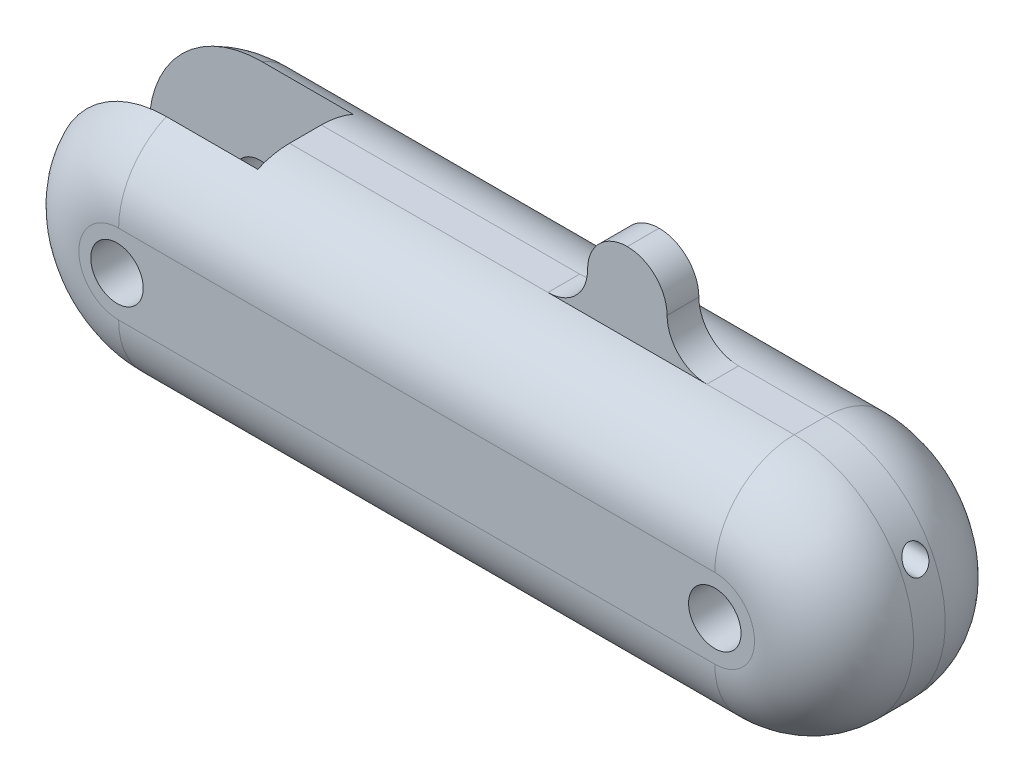
ISO-10303-21;
HEADER;
FILE_DESCRIPTION(('STEP AP214'),'2;1');
FILE_NAME('part.step','',(''),(''),'','','');
FILE_SCHEMA(('AUTOMOTIVE_DESIGN { 1 0 10303 214 1 1 1 1 }'));
ENDSEC;
DATA;
#1=APPLICATION_CONTEXT('core data for automotive mechanical design processes');
#2=APPLICATION_PROTOCOL_DEFINITION('international standard','automotive_design',2000,#1);
#3=PRODUCT_CONTEXT('',#1,'mechanical');
#4=PRODUCT('Part','Part','',(#3));
#5=PRODUCT_RELATED_PRODUCT_CATEGORY('part','',(#4));
#6=PRODUCT_DEFINITION_FORMATION('','',#4);
#7=PRODUCT_DEFINITION_CONTEXT('part definition',#1,'design');
#8=PRODUCT_DEFINITION('design','',#6,#7);
#9=PRODUCT_DEFINITION_SHAPE('','',#8);
#10=(LENGTH_UNIT() NAMED_UNIT(*) SI_UNIT(.MILLI.,.METRE.));
#11=(NAMED_UNIT(*) PLANE_ANGLE_UNIT() SI_UNIT($,.RADIAN.));
#12=(NAMED_UNIT(*) SI_UNIT($,.STERADIAN.) SOLID_ANGLE_UNIT());
#13=UNCERTAINTY_MEASURE_WITH_UNIT(LENGTH_MEASURE(1.E-05),#10,'distance_accuracy_value','');
#14=(GEOMETRIC_REPRESENTATION_CONTEXT(3) GLOBAL_UNCERTAINTY_ASSIGNED_CONTEXT((#13)) GLOBAL_UNIT_ASSIGNED_CONTEXT((#10,
#11,#12)) REPRESENTATION_CONTEXT('',''));
#15=CARTESIAN_POINT('',(0.,0.,0.));
#16=DIRECTION('',(0.,0.,1.));
#17=DIRECTION('',(1.,0.,0.));
#18=AXIS2_PLACEMENT_3D('',#15,#16,#17);
#19=CARTESIAN_POINT('',(-18.75,0.,12.));
#20=DIRECTION('',(0.,-1.,0.));
#21=DIRECTION('',(0.,0.,-1.));
#22=AXIS2_PLACEMENT_3D('',#19,#20,#21);
#23=PLANE('',#22);
#24=DIRECTION('',(-1.,0.,0.));
#25=VECTOR('',#24,1.);
#26=CARTESIAN_POINT('',(-18.75,0.,7.));
#27=LINE('',#26,#25);
#28=CARTESIAN_POINT('',(-13.,0.,7.));
#29=VERTEX_POINT('',#28);
#30=CARTESIAN_POINT('',(3.25,0.,7.));
#31=VERTEX_POINT('',#30);
#32=EDGE_CURVE('E400',#29,#31,#27,.F.);
#33=ORIENTED_EDGE('',*,*,#32,.T.);
#34=DIRECTION('',(0.,0.,1.));
#35=VECTOR('',#34,1.);
#36=CARTESIAN_POINT('',(3.25,0.,5.));
#37=LINE('',#36,#35);
#38=CARTESIAN_POINT('',(3.25,0.,5.));
#39=VERTEX_POINT('',#38);
#40=EDGE_CURVE('E302',#31,#39,#37,.F.);
#41=ORIENTED_EDGE('',*,*,#40,.T.);
#42=DIRECTION('',(-1.,0.,0.));
#43=VECTOR('',#42,1.);
#44=CARTESIAN_POINT('',(-18.75,0.,5.));
#45=LINE('',#44,#43);
#46=CARTESIAN_POINT('',(-13.,0.,5.));
#47=VERTEX_POINT('',#46);
#48=EDGE_CURVE('E402',#39,#47,#45,.T.);
#49=ORIENTED_EDGE('',*,*,#48,.T.);
#50=DIRECTION('',(0.,0.,1.));
#51=VECTOR('',#50,1.);
#52=CARTESIAN_POINT('',(-13.,0.,3.));
#53=LINE('',#52,#51);
#54=EDGE_CURVE('E334',#47,#29,#53,.T.);
#55=ORIENTED_EDGE('',*,*,#54,.T.);
#56=EDGE_LOOP('',(#33,#41,#49,#55));
#57=FACE_BOUND('',#56,.T.);
#58=ADVANCED_FACE('F32',(#57),#23,.F.);
#59=CARTESIAN_POINT('',(18.75,0.,5.));
#60=VERTEX_POINT('',#59);
#61=CARTESIAN_POINT('',(13.25,0.,5.));
#62=VERTEX_POINT('',#61);
#63=EDGE_CURVE('E403',#60,#62,#45,.T.);
#64=ORIENTED_EDGE('',*,*,#63,.T.);
#65=DIRECTION('',(0.,0.,-1.));
#66=VECTOR('',#65,1.);
#67=CARTESIAN_POINT('',(13.25,0.,7.));
#68=LINE('',#67,#66);
#69=CARTESIAN_POINT('',(13.25,0.,7.));
#70=VERTEX_POINT('',#69);
#71=EDGE_CURVE('E309',#62,#70,#68,.F.);
#72=ORIENTED_EDGE('',*,*,#71,.T.);
#73=CARTESIAN_POINT('',(18.75,0.,7.));
#74=VERTEX_POINT('',#73);
#75=EDGE_CURVE('E399',#70,#74,#27,.F.);
#76=ORIENTED_EDGE('',*,*,#75,.T.);
#77=DIRECTION('',(0.,0.,-1.));
#78=VECTOR('',#77,1.);
#79=CARTESIAN_POINT('',(18.75,0.,12.));
#80=LINE('',#79,#78);
#81=EDGE_CURVE('E364',#74,#60,#80,.T.);
#82=ORIENTED_EDGE('',*,*,#81,.T.);
#83=EDGE_LOOP('',(#64,#72,#76,#82));
#84=FACE_BOUND('',#83,.T.);
#85=ADVANCED_FACE('F251',(#84),#23,.F.);
#86=CARTESIAN_POINT('',(18.75,-7.5,12.));
#87=DIRECTION('',(0.,0.,-1.));
#88=DIRECTION('',(-1.,0.,0.));
#89=AXIS2_PLACEMENT_3D('',#86,#87,#88);
#90=CYLINDRICAL_SURFACE('',#89,7.5);
#91=CARTESIAN_POINT('',(25.3832495807108,-4.,5.25));
#92=CARTESIAN_POINT('',(25.4068652100945,-4.04475712896393,5.25000069696609));
#93=CARTESIAN_POINT('',(25.4300293767484,-4.08976492895581,5.25400927517588));
#94=CARTESIAN_POINT('',(25.4748658777341,-4.1790551435472,5.27027538348579));
#95=CARTESIAN_POINT('',(25.4965380552073,-4.22333748150426,5.28253377946583));
#96=CARTESIAN_POINT('',(25.5379116758938,-4.30992682615475,5.31545723063562));
#97=CARTESIAN_POINT('',(25.5576045419242,-4.35222484491178,5.336157060362));
#98=CARTESIAN_POINT('',(25.5943674457023,-4.43298144567067,5.38577757165474));
#99=CARTESIAN_POINT('',(25.6114387598698,-4.47144189295035,5.41469423281491));
#100=CARTESIAN_POINT('',(25.6411623275913,-4.53973742839442,5.47736494318931));
#101=CARTESIAN_POINT('',(25.6540660292328,-4.57002664644258,5.51050419857445));
#102=CARTESIAN_POINT('',(25.6769531189977,-4.62455266895225,5.58231320481981));
#103=CARTESIAN_POINT('',(25.6869382953721,-4.64879317826637,5.62097954737949));
#104=CARTESIAN_POINT('',(25.7029869063967,-4.68817040363519,5.69891372918083));
#105=CARTESIAN_POINT('',(25.7093235719089,-4.70393268754241,5.73781010676271));
#106=CARTESIAN_POINT('',(25.7192604124838,-4.72879255774519,5.81800707831997));
#107=CARTESIAN_POINT('',(25.7228616243726,-4.73789266917448,5.85930675496975));
#108=CARTESIAN_POINT('',(25.7271383733366,-4.74871452689673,5.94068250069715));
#109=CARTESIAN_POINT('',(25.727964010453,-4.75081476114192,5.98070082955287));
#110=CARTESIAN_POINT('',(25.7270983322195,-4.7486184483497,6.0605308390464));
#111=CARTESIAN_POINT('',(25.7254073999443,-4.74432287488856,6.10034255021011));
#112=CARTESIAN_POINT('',(25.7195866751644,-4.72963511410702,6.17795271899597));
#113=CARTESIAN_POINT('',(25.7154973975341,-4.71934422356824,6.21577350399643));
#114=CARTESIAN_POINT('',(25.7049825205337,-4.69314838459035,6.28906769075069));
#115=CARTESIAN_POINT('',(25.6985568521372,-4.67724327028505,6.32454102311476));
#116=CARTESIAN_POINT('',(25.6833388667533,-4.6400662297977,6.3928822815331));
#117=CARTESIAN_POINT('',(25.6745047094671,-4.61869988546116,6.42568939411337));
#118=CARTESIAN_POINT('',(25.6546866646446,-4.57152680231289,6.48719637753227));
#119=CARTESIAN_POINT('',(25.6437023940896,-4.54571927245274,6.51589551500178));
#120=CARTESIAN_POINT('',(25.6191641560276,-4.48908949081756,6.57000258230613));
#121=CARTESIAN_POINT('',(25.6055068553954,-4.45807722125552,6.59516434647811));
#122=CARTESIAN_POINT('',(25.5763026183871,-4.39309447378723,6.63994971569264));
#123=CARTESIAN_POINT('',(25.5607550987679,-4.35912308374077,6.65957160512374));
#124=CARTESIAN_POINT('',(25.5267476900571,-4.28636850281493,6.69444106370555));
#125=CARTESIAN_POINT('',(25.5081540750848,-4.24741815677612,6.709208755228));
#126=CARTESIAN_POINT('',(25.46950375169,-4.1683021174959,6.73203260387972));
#127=CARTESIAN_POINT('',(25.4494464555126,-4.12813593985681,6.74008604853172));
#128=CARTESIAN_POINT('',(25.4063085373536,-4.04369983150147,6.75004397376913));
#129=CARTESIAN_POINT('',(25.3831223675881,-3.99940542782164,6.75128539519353));
#130=CARTESIAN_POINT('',(25.3360588230827,-3.9116419942855,6.74607476207136));
#131=CARTESIAN_POINT('',(25.3121811684306,-3.86817331081141,6.73961954823107));
#132=CARTESIAN_POINT('',(25.2624790173255,-3.77973344935154,6.71847576043198));
#133=CARTESIAN_POINT('',(25.236647679833,-3.73490877068936,6.7031853128459));
#134=CARTESIAN_POINT('',(25.1857343535149,-3.64852752977385,6.66423898345622));
#135=CARTESIAN_POINT('',(25.1606529100033,-3.60697331155974,6.6405771671965));
#136=CARTESIAN_POINT('',(25.1121650327383,-3.52822396654694,6.58503138384833));
#137=CARTESIAN_POINT('',(25.0887675581801,-3.49105156771563,6.55310707545873));
#138=CARTESIAN_POINT('',(25.0451208610375,-3.42285769464485,6.48149765334737));
#139=CARTESIAN_POINT('',(25.0248655342586,-3.39182426121487,6.44182793409187));
#140=CARTESIAN_POINT('',(24.9941296604099,-3.34531674164022,6.36773463912215));
#141=CARTESIAN_POINT('',(24.9825031742713,-3.32792254459538,6.33498389337064));
#142=CARTESIAN_POINT('',(24.9623269530317,-3.29793850852277,6.266466154486));
#143=CARTESIAN_POINT('',(24.9537747168345,-3.28534476351841,6.23070164261996));
#144=CARTESIAN_POINT('',(24.9402984185428,-3.26557533684953,6.15681284743056));
#145=CARTESIAN_POINT('',(24.9353946024228,-3.2584298837293,6.11867665017428));
#146=CARTESIAN_POINT('',(24.9297033076017,-3.25014186597953,6.04145384644772));
#147=CARTESIAN_POINT('',(24.9289142561407,-3.2489970077805,6.00236760884515));
#148=CARTESIAN_POINT('',(24.9313931710046,-3.25260309406563,5.92827495646399));
#149=CARTESIAN_POINT('',(24.9342899276402,-3.25681456761362,5.8932277732572));
#150=CARTESIAN_POINT('',(24.943308211172,-3.26998861428829,5.82447604328706));
#151=CARTESIAN_POINT('',(24.9494299026123,-3.27895142984032,5.79077156512622));
#152=CARTESIAN_POINT('',(24.9646133796125,-3.30133780469566,5.72505739919943));
#153=CARTESIAN_POINT('',(24.9737143408386,-3.31482086291967,5.69307729890249));
#154=CARTESIAN_POINT('',(24.9943359325697,-3.3456514298456,5.63189268510943));
#155=CARTESIAN_POINT('',(25.005857406406,-3.36300028555895,5.60268914415963));
#156=CARTESIAN_POINT('',(25.0323887723703,-3.40338626249218,5.54395537476474));
#157=CARTESIAN_POINT('',(25.0476550846796,-3.42686421313565,5.51484516788648));
#158=CARTESIAN_POINT('',(25.0799678350555,-3.47726403649822,5.46091603715502));
#159=CARTESIAN_POINT('',(25.0970153888876,-3.50418807023977,5.43609982921319));
#160=CARTESIAN_POINT('',(25.1352466837685,-3.56551988782083,5.38721317350811));
#161=CARTESIAN_POINT('',(25.1566486852218,-3.60042939812047,5.3639419420298));
#162=CARTESIAN_POINT('',(25.2003628456514,-3.67317076129835,5.32367729284259));
#163=CARTESIAN_POINT('',(25.2226753450833,-3.71100371213012,5.30668624776824));
#164=CARTESIAN_POINT('',(25.2682375061319,-3.78991735324902,5.2787743942519));
#165=CARTESIAN_POINT('',(25.2914956207364,-3.83106029081337,5.26804311416664));
#166=CARTESIAN_POINT('',(25.3377229967265,-3.91472586515507,5.25365538695503));
#167=CARTESIAN_POINT('',(25.3606922419369,-3.95724857871951,5.24999933426715));
#168=CARTESIAN_POINT('',(25.3832495807108,-4.,5.25));
#169=B_SPLINE_CURVE_WITH_KNOTS('',3,(#91,#92,#93,#94,#95,#96,#97,#98,#99,#100,#101,#102,#103,
#104,#105,#106,#107,#108,#109,#110,#111,#112,#113,#114,#115,#116,#117,#118,#119,#120,#121,#122,
#123,#124,#125,#126,#127,#128,#129,#130,#131,#132,#133,#134,#135,#136,#137,#138,#139,#140,#141,
#142,#143,#144,#145,#146,#147,#148,#149,#150,#151,#152,#153,#154,#155,#156,#157,#158,#159,#160,
#161,#162,#163,#164,#165,#166,#167,#168),.UNSPECIFIED.,.T.,.F.,(4,2,2,2,2,2,2,2,2,2,2,2,2,2,2,2,
2,2,2,2,2,2,2,2,2,2,2,2,2,2,2,2,2,2,2,2,2,2,4),(0.,0.151661005421156,0.303337931279043,
0.455646106620899,0.607879887173716,0.747256765609741,0.886548064567126,1.0132272857131,
1.13985846730141,1.25952084912075,1.37916501767402,1.49684401087809,1.61452648107236,
1.73440026024667,1.85429541305984,1.98037574012026,2.10649506953991,2.24277688192368,
2.37911372392493,2.5285129963975,2.67797361499162,2.83907034561564,3.00028150715968,
3.16229513316742,3.32398996653119,3.44011001590396,3.55613537933345,3.67279988942347,
3.78941980432112,3.89517224873058,4.00093008941375,4.10813854282546,4.21538441088787,
4.33610582335719,4.45690331400403,4.59763975196048,4.73842930548272,4.88328582896064,
5.02815042784518),.UNSPECIFIED.);
#170=CARTESIAN_POINT('',(25.3832495807108,-4.,5.25));
#171=VERTEX_POINT('',#170);
#172=EDGE_CURVE('E180',#171,#171,#169,.T.);
#173=ORIENTED_EDGE('',*,*,#172,.T.);
#174=EDGE_LOOP('',(#173));
#175=FACE_BOUND('',#174,.T.);
#176=DIRECTION('',(0.,0.,-1.));
#177=VECTOR('',#176,1.);
#178=CARTESIAN_POINT('',(18.75,-15.,12.));
#179=LINE('',#178,#177);
#180=CARTESIAN_POINT('',(18.75,-15.,7.));
#181=VERTEX_POINT('',#180);
#182=CARTESIAN_POINT('',(18.75,-15.,5.));
#183=VERTEX_POINT('',#182);
#184=EDGE_CURVE('E361',#181,#183,#179,.T.);
#185=ORIENTED_EDGE('',*,*,#184,.T.);
#186=CARTESIAN_POINT('',(18.75,-7.5,5.));
#187=DIRECTION('',(0.,0.,-1.));
#188=DIRECTION('',(-1.,0.,0.));
#189=AXIS2_PLACEMENT_3D('',#186,#187,#188);
#190=CIRCLE('',#189,7.5);
#191=EDGE_CURVE('E371',#183,#60,#190,.F.);
#192=ORIENTED_EDGE('',*,*,#191,.T.);
#193=ORIENTED_EDGE('',*,*,#81,.F.);
#194=CARTESIAN_POINT('',(18.75,-7.5,7.));
#195=DIRECTION('',(0.,0.,-1.));
#196=DIRECTION('',(-1.,0.,0.));
#197=AXIS2_PLACEMENT_3D('',#194,#195,#196);
#198=CIRCLE('',#197,7.5);
#199=EDGE_CURVE('E368',#74,#181,#198,.T.);
#200=ORIENTED_EDGE('',*,*,#199,.T.);
#201=EDGE_LOOP('',(#185,#192,#193,#200));
#202=FACE_BOUND('',#201,.T.);
#203=ADVANCED_FACE('F256',(#175,#202),#90,.T.);
#204=CARTESIAN_POINT('',(-18.75,-15.,12.));
#205=DIRECTION('',(0.,1.,0.));
#206=DIRECTION('',(0.,0.,1.));
#207=AXIS2_PLACEMENT_3D('',#204,#205,#206);
#208=PLANE('',#207);
#209=DIRECTION('',(0.,0.,1.));
#210=VECTOR('',#209,1.);
#211=CARTESIAN_POINT('',(12.75,-15.,12.));
#212=LINE('',#211,#210);
#213=CARTESIAN_POINT('',(12.75,-15.,5.25));
#214=VERTEX_POINT('',#213);
#215=CARTESIAN_POINT('',(12.75,-15.,6.75));
#216=VERTEX_POINT('',#215);
#217=EDGE_CURVE('E11',#214,#216,#212,.T.);
#218=ORIENTED_EDGE('',*,*,#217,.F.);
#219=CARTESIAN_POINT('',(12.75,-15.,5.25));
#220=CARTESIAN_POINT('',(12.6279031105187,-14.9999999999993,5.25000254582657));
#221=CARTESIAN_POINT('',(12.5058081520973,-14.9999999999997,5.25071867078466));
#222=CARTESIAN_POINT('',(12.2616319605479,-15.0000000000003,5.25360404575604));
#223=CARTESIAN_POINT('',(12.1395507279131,-15.0000000000007,5.25577333739408));
#224=CARTESIAN_POINT('',(11.7733405529742,-14.9999999999987,5.26450014872843));
#225=CARTESIAN_POINT('',(11.5292574943999,-14.9999999999933,5.27327660984739));
#226=CARTESIAN_POINT('',(11.1634166185596,-14.9999999999986,5.29137442259027));
#227=CARTESIAN_POINT('',(11.0415324736972,-15.0000000000026,5.29822802504211));
#228=CARTESIAN_POINT('',(10.7978820366982,-14.9999999999974,5.31373211707596));
#229=CARTESIAN_POINT('',(10.6761157396577,-14.9999999999882,5.32238252834828));
#230=CARTESIAN_POINT('',(10.4327271316951,-14.9999999999879,5.34168698501698));
#231=CARTESIAN_POINT('',(10.3111048387448,-14.9999999999968,5.35234125842443));
#232=CARTESIAN_POINT('',(10.0680838593875,-15.0000000000033,5.37595354459899));
#233=CARTESIAN_POINT('',(9.94668516822044,-15.0000000000009,5.38891150773847));
#234=CARTESIAN_POINT('',(9.70416943419978,-14.9999999999991,5.41759079486999));
#235=CARTESIAN_POINT('',(9.58305250341022,-14.9999999999998,5.43331307403886));
#236=CARTESIAN_POINT('',(9.34132147564355,-15.0000000000002,5.4682213234766));
#237=CARTESIAN_POINT('',(9.22070730910105,-15.,5.48740679710216));
#238=CARTESIAN_POINT('',(9.04042541137695,-15.,5.51974697076756));
#239=CARTESIAN_POINT('',(8.98043847484635,-15.,5.53112058542195));
#240=CARTESIAN_POINT('',(8.86076281607908,-15.,5.55532858674183));
#241=CARTESIAN_POINT('',(8.80107406711756,-15.,5.5681628399546));
#242=CARTESIAN_POINT('',(8.68207329683169,-15.,5.59569278146662));
#243=CARTESIAN_POINT('',(8.6227615995042,-15.,5.61038988967094));
#244=CARTESIAN_POINT('',(8.50480756744824,-15.,5.64227280695698));
#245=CARTESIAN_POINT('',(8.44616515917928,-15.0000000000002,5.65945833971805));
#246=CARTESIAN_POINT('',(8.33798530591541,-14.9999999999999,5.69485454825117));
#247=CARTESIAN_POINT('',(8.28830180896599,-14.9999999999995,5.71260167382619));
#248=CARTESIAN_POINT('',(8.21498970784326,-15.0000000000003,5.74244029179922));
#249=CARTESIAN_POINT('',(8.19072098307633,-15.0000000000007,5.75294000274481));
#250=CARTESIAN_POINT('',(8.14287182875721,-14.9999999999993,5.77537551038227));
#251=CARTESIAN_POINT('',(8.11929093980555,-14.9999999999974,5.78731031996813));
#252=CARTESIAN_POINT('',(8.07298517106077,-14.9999999999971,5.81332910183128));
#253=CARTESIAN_POINT('',(8.05027079541636,-14.9999999999987,5.82743277194824));
#254=CARTESIAN_POINT('',(8.01796405003157,-15.0000000000007,5.85090587661612));
#255=CARTESIAN_POINT('',(8.00751768539581,-15.0000000000013,5.85908882758918));
#256=CARTESIAN_POINT('',(7.98747272431623,-14.9999999999987,5.8764702220878));
#257=CARTESIAN_POINT('',(7.97787445964953,-14.9999999999956,5.88566905989046));
#258=CARTESIAN_POINT('',(7.96197651849764,-14.9999999999965,5.9032226478368));
#259=CARTESIAN_POINT('',(7.95541141170035,-14.9999999999991,5.91133333657225));
#260=CARTESIAN_POINT('',(7.94357475708405,-15.0000000000009,5.92845584522835));
#261=CARTESIAN_POINT('',(7.93829991256084,-15.0000000000002,5.93746528398026));
#262=CARTESIAN_POINT('',(7.93102890539874,-14.9999999999999,5.95338584477557));
#263=CARTESIAN_POINT('',(7.92852338987217,-15.,5.96006134589919));
#264=CARTESIAN_POINT('',(7.92463907779112,-15.,5.97372494061358));
#265=CARTESIAN_POINT('',(7.92325755163829,-15.,5.98071223318449));
#266=CARTESIAN_POINT('',(7.92177187965733,-15.,5.99487053913656));
#267=CARTESIAN_POINT('',(7.92167585014173,-15.,6.0020424336657));
#268=CARTESIAN_POINT('',(7.92279483226025,-15.,6.01628349356545));
#269=CARTESIAN_POINT('',(7.92401067645951,-14.9999999999999,6.02335259080985));
#270=CARTESIAN_POINT('',(7.92790254589006,-14.9999999999999,6.03832350402544));
#271=CARTESIAN_POINT('',(7.9307864450267,-15.,6.04617019809489));
#272=CARTESIAN_POINT('',(7.93778340081414,-15.,6.06130848636014));
#273=CARTESIAN_POINT('',(7.94190102609121,-15.,6.0685978886684));
#274=CARTESIAN_POINT('',(7.95403672459536,-15.,6.08721238904936));
#275=CARTESIAN_POINT('',(7.96283432361819,-15.,6.09802166566266));
#276=CARTESIAN_POINT('',(7.98184773151495,-15.,6.11828939144204));
#277=CARTESIAN_POINT('',(7.99206733096049,-15.,6.12774408831073));
#278=CARTESIAN_POINT('',(8.01851487670459,-15.,6.14991608934695));
#279=CARTESIAN_POINT('',(8.03526215285465,-15.0000000000001,6.16200571208245));
#280=CARTESIAN_POINT('',(8.06976260503723,-14.9999999999999,6.18456586503625));
#281=CARTESIAN_POINT('',(8.08751538802825,-14.9999999999998,6.19503702200761));
#282=CARTESIAN_POINT('',(8.12375830799411,-15.0000000000002,6.21485783216037));
#283=CARTESIAN_POINT('',(8.14225198370346,-15.0000000000009,6.22420095391308));
#284=CARTESIAN_POINT('',(8.17967471385401,-14.9999999999991,6.24197726025423));
#285=CARTESIAN_POINT('',(8.19860394623334,-14.9999999999966,6.25041006464596));
#286=CARTESIAN_POINT('',(8.25834246410656,-14.9999999999936,6.27569455474348));
#287=CARTESIAN_POINT('',(8.29968517632697,-14.9999999999983,6.29128139751974));
#288=CARTESIAN_POINT('',(8.38312371622844,-15.0000000000017,6.3202980439071));
#289=CARTESIAN_POINT('',(8.42521999971808,-15.0000000000002,6.33372648936706));
#290=CARTESIAN_POINT('',(8.50975620317274,-14.9999999999998,6.35894851885767));
#291=CARTESIAN_POINT('',(8.55219467577112,-15.0000000000009,6.37074698412765));
#292=CARTESIAN_POINT('',(8.63739549369142,-14.9999999999992,6.39311197102598));
#293=CARTESIAN_POINT('',(8.68015787179652,-14.9999999999964,6.40367836613043));
#294=CARTESIAN_POINT('',(8.8084253424861,-14.9999999999934,6.43381026509647));
#295=CARTESIAN_POINT('',(8.89427395501594,-14.9999999999982,6.45191160186388));
#296=CARTESIAN_POINT('',(9.06652220515574,-15.0000000000018,6.48533687297484));
#297=CARTESIAN_POINT('',(9.15292200408572,-15.0000000000005,6.50065995157057));
#298=CARTESIAN_POINT('',(9.32606662089015,-14.9999999999995,6.5291452930602));
#299=CARTESIAN_POINT('',(9.41281140650453,-14.9999999999999,6.54230775334602));
#300=CARTESIAN_POINT('',(9.58655116393535,-15.0000000000001,6.56687586340296));
#301=CARTESIAN_POINT('',(9.67354614947086,-15.,6.5782814148926));
#302=CARTESIAN_POINT('',(9.93480730803937,-14.9999999999999,6.6102886368843));
#303=CARTESIAN_POINT('',(10.1093447506604,-15.,6.62868010052604));
#304=CARTESIAN_POINT('',(10.4773004566364,-15.,6.66262753595207));
#305=CARTESIAN_POINT('',(10.6707639203776,-15.,6.67767813701678));
#306=CARTESIAN_POINT('',(11.0579726998644,-15.,6.70319345371234));
#307=CARTESIAN_POINT('',(11.2517179929587,-15.,6.71365851944845));
#308=CARTESIAN_POINT('',(11.6627681470924,-15.,6.73157677656177));
#309=CARTESIAN_POINT('',(11.880095448928,-15.,6.73851430325681));
#310=CARTESIAN_POINT('',(12.206207476606,-15.,6.74542192216146));
#311=CARTESIAN_POINT('',(12.3149586134388,-15.,6.74714134210136));
#312=CARTESIAN_POINT('',(12.5324728588604,-15.,6.74942945468232));
#313=CARTESIAN_POINT('',(12.6412359674309,-15.,6.74999814905208));
#314=CARTESIAN_POINT('',(12.75,-15.,6.75));
#315=B_SPLINE_CURVE_WITH_KNOTS('',3,(#219,#220,#221,#222,#223,#224,#225,#226,#227,#228,#229,
#230,#231,#232,#233,#234,#235,#236,#237,#238,#239,#240,#241,#242,#243,#244,#245,#246,#247,#248,
#249,#250,#251,#252,#253,#254,#255,#256,#257,#258,#259,#260,#261,#262,#263,#264,#265,#266,#267,
#268,#269,#270,#271,#272,#273,#274,#275,#276,#277,#278,#279,#280,#281,#282,#283,#284,#285,#286,
#287,#288,#289,#290,#291,#292,#293,#294,#295,#296,#297,#298,#299,#300,#301,#302,#303,#304,#305,
#306,#307,#308,#309,#310,#311,#312,#313,#314),.UNSPECIFIED.,.F.,.F.,(4,2,2,2,2,2,2,2,2,2,2,2,2,
2,2,2,2,2,2,2,2,2,2,2,2,2,2,2,2,2,2,2,2,2,2,2,2,2,2,2,2,2,2,2,2,2,2,4),(0.,0.366284571835835,
0.732579636039433,1.46520683800824,1.83142702707227,2.19763125864202,2.56387718429462,
2.930115220988,3.29648005651964,3.66279239476767,3.84594567424035,4.02908223314375,
4.21235923140004,4.3956158937227,4.55374880961848,4.63304046269176,4.71227788513852,
4.79228283253039,4.83204995805504,4.87183257225204,4.90305778328536,4.93420235836351,
4.95551354701654,4.97677282584144,4.99816626772046,5.01957329468434,5.04451339878243,
5.06954702497481,5.11112127609883,5.15280855242251,5.21461546426789,5.27639838100998,
5.3385234213964,5.40067430891038,5.53311600243491,5.6656407101249,5.7977595250195,
5.92989189554795,6.19302526096668,6.45623953847942,6.71942975560115,6.98263469024013,
7.50905952918245,8.09114162758407,8.67317927631539,9.32543431410319,9.65172349145941,
9.97801217864142),.UNSPECIFIED.);
#316=EDGE_CURVE('E172',#214,#216,#315,.T.);
#317=ORIENTED_EDGE('',*,*,#316,.T.);
#318=EDGE_LOOP('',(#218,#317));
#319=FACE_BOUND('',#318,.T.);
#320=DIRECTION('',(1.,0.,0.));
#321=VECTOR('',#320,1.);
#322=CARTESIAN_POINT('',(-18.75,-15.,7.));
#323=LINE('',#322,#321);
#324=CARTESIAN_POINT('',(-13.,-15.,7.));
#325=VERTEX_POINT('',#324);
#326=EDGE_CURVE('E384',#181,#325,#323,.F.);
#327=ORIENTED_EDGE('',*,*,#326,.T.);
#328=DIRECTION('',(0.,0.,-1.));
#329=VECTOR('',#328,1.);
#330=CARTESIAN_POINT('',(-13.,-15.,12.));
#331=LINE('',#330,#329);
#332=CARTESIAN_POINT('',(-13.,-15.,5.));
#333=VERTEX_POINT('',#332);
#334=EDGE_CURVE('E349',#325,#333,#331,.T.);
#335=ORIENTED_EDGE('',*,*,#334,.T.);
#336=DIRECTION('',(1.,0.,0.));
#337=VECTOR('',#336,1.);
#338=CARTESIAN_POINT('',(18.75,-15.,5.));
#339=LINE('',#338,#337);
#340=EDGE_CURVE('E387',#333,#183,#339,.T.);
#341=ORIENTED_EDGE('',*,*,#340,.T.);
#342=ORIENTED_EDGE('',*,*,#184,.F.);
#343=EDGE_LOOP('',(#327,#335,#341,#342));
#344=FACE_BOUND('',#343,.T.);
#345=ADVANCED_FACE('F175',(#319,#344),#208,.F.);
#346=CARTESIAN_POINT('',(18.75,-7.5,12.));
#347=DIRECTION('',(0.,0.,-1.));
#348=DIRECTION('',(-1.,0.,0.));
#349=AXIS2_PLACEMENT_3D('',#346,#347,#348);
#350=PLANE('',#349);
#351=CARTESIAN_POINT('',(18.75,-7.50000000000001,12.));
#352=DIRECTION('',(0.,0.,1.));
#353=DIRECTION('',(1.,0.,0.));
#354=AXIS2_PLACEMENT_3D('',#351,#352,#353);
#355=CIRCLE('',#354,1.65);
#356=CARTESIAN_POINT('',(20.4,-7.50000000000001,12.));
#357=VERTEX_POINT('',#356);
#358=EDGE_CURVE('E330',#357,#357,#355,.T.);
#359=ORIENTED_EDGE('',*,*,#358,.F.);
#360=EDGE_LOOP('',(#359));
#361=FACE_BOUND('',#360,.T.);
#362=CARTESIAN_POINT('',(-18.8534779771691,-7.50000000000001,12.));
#363=DIRECTION('',(0.,0.,1.));
#364=DIRECTION('',(1.,0.,0.));
#365=AXIS2_PLACEMENT_3D('',#362,#363,#364);
#366=CIRCLE('',#365,1.65);
#367=CARTESIAN_POINT('',(-17.2034779771691,-7.50000000000001,12.));
#368=VERTEX_POINT('',#367);
#369=EDGE_CURVE('E323',#368,#368,#366,.T.);
#370=ORIENTED_EDGE('',*,*,#369,.F.);
#371=EDGE_LOOP('',(#370));
#372=FACE_BOUND('',#371,.T.);
#373=DIRECTION('',(1.,0.,0.));
#374=VECTOR('',#373,1.);
#375=CARTESIAN_POINT('',(18.75,-10.,12.));
#376=LINE('',#375,#374);
#377=CARTESIAN_POINT('',(-18.75,-10.,12.));
#378=VERTEX_POINT('',#377);
#379=CARTESIAN_POINT('',(18.75,-10.,12.));
#380=VERTEX_POINT('',#379);
#381=EDGE_CURVE('E394',#378,#380,#376,.T.);
#382=ORIENTED_EDGE('',*,*,#381,.T.);
#383=CARTESIAN_POINT('',(18.75,-7.5,12.));
#384=DIRECTION('',(0.,0.,-1.));
#385=DIRECTION('',(-1.,0.,0.));
#386=AXIS2_PLACEMENT_3D('',#383,#384,#385);
#387=CIRCLE('',#386,2.5);
#388=CARTESIAN_POINT('',(18.75,-5.,12.));
#389=VERTEX_POINT('',#388);
#390=EDGE_CURVE('E396',#380,#389,#387,.F.);
#391=ORIENTED_EDGE('',*,*,#390,.T.);
#392=DIRECTION('',(-1.,0.,0.));
#393=VECTOR('',#392,1.);
#394=CARTESIAN_POINT('',(18.75,-5.,12.));
#395=LINE('',#394,#393);
#396=CARTESIAN_POINT('',(-18.75,-5.,12.));
#397=VERTEX_POINT('',#396);
#398=EDGE_CURVE('E389',#389,#397,#395,.T.);
#399=ORIENTED_EDGE('',*,*,#398,.T.);
#400=CARTESIAN_POINT('',(-18.75,-7.5,12.));
#401=DIRECTION('',(0.,0.,-1.));
#402=DIRECTION('',(-1.,0.,0.));
#403=AXIS2_PLACEMENT_3D('',#400,#401,#402);
#404=CIRCLE('',#403,2.5);
#405=EDGE_CURVE('E392',#397,#378,#404,.F.);
#406=ORIENTED_EDGE('',*,*,#405,.T.);
#407=EDGE_LOOP('',(#382,#391,#399,#406));
#408=FACE_BOUND('',#407,.T.);
#409=ADVANCED_FACE('F235',(#361,#372,#408),#350,.F.);
#410=CARTESIAN_POINT('',(18.75,-7.5,0.));
#411=DIRECTION('',(0.,0.,-1.));
#412=DIRECTION('',(-1.,0.,0.));
#413=AXIS2_PLACEMENT_3D('',#410,#411,#412);
#414=PLANE('',#413);
#415=CARTESIAN_POINT('',(18.75,-7.50000000000001,0.));
#416=DIRECTION('',(0.,0.,1.));
#417=DIRECTION('',(1.,0.,0.));
#418=AXIS2_PLACEMENT_3D('',#415,#416,#417);
#419=CIRCLE('',#418,1.65);
#420=CARTESIAN_POINT('',(20.4,-7.50000000000001,0.));
#421=VERTEX_POINT('',#420);
#422=EDGE_CURVE('E327',#421,#421,#419,.T.);
#423=ORIENTED_EDGE('',*,*,#422,.T.);
#424=EDGE_LOOP('',(#423));
#425=FACE_BOUND('',#424,.T.);
#426=CARTESIAN_POINT('',(-18.8534779771691,-7.50000000000001,0.));
#427=DIRECTION('',(0.,0.,1.));
#428=DIRECTION('',(1.,0.,0.));
#429=AXIS2_PLACEMENT_3D('',#426,#427,#428);
#430=CIRCLE('',#429,1.65);
#431=CARTESIAN_POINT('',(-17.2034779771691,-7.50000000000001,0.));
#432=VERTEX_POINT('',#431);
#433=EDGE_CURVE('E317',#432,#432,#430,.T.);
#434=ORIENTED_EDGE('',*,*,#433,.T.);
#435=EDGE_LOOP('',(#434));
#436=FACE_BOUND('',#435,.T.);
#437=DIRECTION('',(-1.,0.,0.));
#438=VECTOR('',#437,1.);
#439=CARTESIAN_POINT('',(18.75,-5.,0.));
#440=LINE('',#439,#438);
#441=CARTESIAN_POINT('',(-18.75,-5.,0.));
#442=VERTEX_POINT('',#441);
#443=CARTESIAN_POINT('',(18.75,-5.,0.));
#444=VERTEX_POINT('',#443);
#445=EDGE_CURVE('E374',#442,#444,#440,.F.);
#446=ORIENTED_EDGE('',*,*,#445,.T.);
#447=CARTESIAN_POINT('',(18.75,-7.5,0.));
#448=DIRECTION('',(0.,0.,-1.));
#449=DIRECTION('',(-1.,0.,0.));
#450=AXIS2_PLACEMENT_3D('',#447,#448,#449);
#451=CIRCLE('',#450,2.5);
#452=CARTESIAN_POINT('',(18.75,-10.,0.));
#453=VERTEX_POINT('',#452);
#454=EDGE_CURVE('E381',#444,#453,#451,.T.);
#455=ORIENTED_EDGE('',*,*,#454,.T.);
#456=DIRECTION('',(1.,0.,0.));
#457=VECTOR('',#456,1.);
#458=CARTESIAN_POINT('',(-18.75,-10.,0.));
#459=LINE('',#458,#457);
#460=CARTESIAN_POINT('',(-18.75,-10.,0.));
#461=VERTEX_POINT('',#460);
#462=EDGE_CURVE('E378',#453,#461,#459,.F.);
#463=ORIENTED_EDGE('',*,*,#462,.T.);
#464=CARTESIAN_POINT('',(-18.75,-7.5,0.));
#465=DIRECTION('',(0.,0.,-1.));
#466=DIRECTION('',(-1.,0.,0.));
#467=AXIS2_PLACEMENT_3D('',#464,#465,#466);
#468=CIRCLE('',#467,2.5);
#469=EDGE_CURVE('E376',#461,#442,#468,.T.);
#470=ORIENTED_EDGE('',*,*,#469,.T.);
#471=EDGE_LOOP('',(#446,#455,#463,#470));
#472=FACE_BOUND('',#471,.T.);
#473=ADVANCED_FACE('F237',(#425,#436,#472),#414,.T.);
#474=CARTESIAN_POINT('',(-18.75,-7.5,5.));
#475=DIRECTION('',(0.,0.,-1.));
#476=DIRECTION('',(-1.,0.,0.));
#477=AXIS2_PLACEMENT_3D('',#474,#475,#476);
#478=DEGENERATE_TOROIDAL_SURFACE('',#477,2.5,5.,.T.);
#479=CARTESIAN_POINT('',(-18.75,-7.5,3.));
#480=DIRECTION('',(0.,0.,-1.));
#481=DIRECTION('',(-1.,0.,0.));
#482=AXIS2_PLACEMENT_3D('',#479,#480,#481);
#483=CIRCLE('',#482,7.08257569495584);
#484=CARTESIAN_POINT('',(-18.75,-0.41742430504416,3.));
#485=VERTEX_POINT('',#484);
#486=CARTESIAN_POINT('',(-18.75,-14.5825756949558,3.));
#487=VERTEX_POINT('',#486);
#488=EDGE_CURVE('E356',#485,#487,#483,.F.);
#489=ORIENTED_EDGE('',*,*,#488,.F.);
#490=CARTESIAN_POINT('',(-18.75,-5.,5.));
#491=DIRECTION('',(1.,0.,0.));
#492=DIRECTION('',(0.,1.,0.));
#493=AXIS2_PLACEMENT_3D('',#490,#491,#492);
#494=CIRCLE('',#493,5.);
#495=EDGE_CURVE('E411',#442,#485,#494,.T.);
#496=ORIENTED_EDGE('',*,*,#495,.F.);
#497=ORIENTED_EDGE('',*,*,#469,.F.);
#498=CARTESIAN_POINT('',(-18.75,-10.,5.));
#499=DIRECTION('',(1.,0.,0.));
#500=DIRECTION('',(0.,1.,0.));
#501=AXIS2_PLACEMENT_3D('',#498,#499,#500);
#502=CIRCLE('',#501,5.);
#503=EDGE_CURVE('E365',#487,#461,#502,.T.);
#504=ORIENTED_EDGE('',*,*,#503,.F.);
#505=EDGE_LOOP('',(#489,#496,#497,#504));
#506=FACE_BOUND('',#505,.T.);
#507=ADVANCED_FACE('F240',(#506),#478,.T.);
#508=CARTESIAN_POINT('',(-18.75,-10.,5.));
#509=DIRECTION('',(-1.,0.,0.));
#510=DIRECTION('',(0.,0.,1.));
#511=AXIS2_PLACEMENT_3D('',#508,#509,#510);
#512=CYLINDRICAL_SURFACE('',#511,5.);
#513=CARTESIAN_POINT('',(-13.,-10.,5.));
#514=DIRECTION('',(1.,0.,0.));
#515=DIRECTION('',(0.,0.,-1.));
#516=AXIS2_PLACEMENT_3D('',#513,#514,#515);
#517=CIRCLE('',#516,5.);
#518=CARTESIAN_POINT('',(-13.,-14.5825756949558,3.));
#519=VERTEX_POINT('',#518);
#520=EDGE_CURVE('E352',#519,#333,#517,.F.);
#521=ORIENTED_EDGE('',*,*,#520,.F.);
#522=DIRECTION('',(-1.,0.,0.));
#523=VECTOR('',#522,1.);
#524=CARTESIAN_POINT('',(-18.75,-14.5825756949558,3.));
#525=LINE('',#524,#523);
#526=EDGE_CURVE('E358',#487,#519,#525,.F.);
#527=ORIENTED_EDGE('',*,*,#526,.F.);
#528=ORIENTED_EDGE('',*,*,#503,.T.);
#529=ORIENTED_EDGE('',*,*,#462,.F.);
#530=CARTESIAN_POINT('',(18.75,-10.,5.));
#531=DIRECTION('',(1.,0.,0.));
#532=DIRECTION('',(0.,0.,-1.));
#533=AXIS2_PLACEMENT_3D('',#530,#531,#532);
#534=CIRCLE('',#533,5.);
#535=EDGE_CURVE('E408',#183,#453,#534,.T.);
#536=ORIENTED_EDGE('',*,*,#535,.F.);
#537=ORIENTED_EDGE('',*,*,#340,.F.);
#538=EDGE_LOOP('',(#521,#527,#528,#529,#536,#537));
#539=FACE_BOUND('',#538,.T.);
#540=ADVANCED_FACE('F245',(#539),#512,.T.);
#541=CARTESIAN_POINT('',(-18.75,-5.,5.));
#542=DIRECTION('',(1.,0.,0.));
#543=DIRECTION('',(0.,0.,-1.));
#544=AXIS2_PLACEMENT_3D('',#541,#542,#543);
#545=CYLINDRICAL_SURFACE('',#544,5.);
#546=CARTESIAN_POINT('',(-13.,-5.,5.));
#547=DIRECTION('',(1.,0.,0.));
#548=DIRECTION('',(0.,0.,-1.));
#549=AXIS2_PLACEMENT_3D('',#546,#547,#548);
#550=CIRCLE('',#549,5.);
#551=CARTESIAN_POINT('',(-13.,-0.41742430504416,3.));
#552=VERTEX_POINT('',#551);
#553=EDGE_CURVE('E354',#47,#552,#550,.F.);
#554=ORIENTED_EDGE('',*,*,#553,.F.);
#555=ORIENTED_EDGE('',*,*,#48,.F.);
#556=DIRECTION('',(-1.,0.,0.));
#557=VECTOR('',#556,1.);
#558=CARTESIAN_POINT('',(5.75,0.,5.));
#559=LINE('',#558,#557);
#560=EDGE_CURVE('E54',#62,#39,#559,.T.);
#561=ORIENTED_EDGE('',*,*,#560,.F.);
#562=ORIENTED_EDGE('',*,*,#63,.F.);
#563=CARTESIAN_POINT('',(18.75,-5.,5.));
#564=DIRECTION('',(1.,0.,0.));
#565=DIRECTION('',(0.,0.,-1.));
#566=AXIS2_PLACEMENT_3D('',#563,#564,#565);
#567=CIRCLE('',#566,5.);
#568=EDGE_CURVE('E406',#444,#60,#567,.T.);
#569=ORIENTED_EDGE('',*,*,#568,.F.);
#570=ORIENTED_EDGE('',*,*,#445,.F.);
#571=ORIENTED_EDGE('',*,*,#495,.T.);
#572=DIRECTION('',(1.,0.,0.));
#573=VECTOR('',#572,1.);
#574=CARTESIAN_POINT('',(-18.75,-0.41742430504416,3.));
#575=LINE('',#574,#573);
#576=EDGE_CURVE('E425',#552,#485,#575,.F.);
#577=ORIENTED_EDGE('',*,*,#576,.F.);
#578=EDGE_LOOP('',(#554,#555,#561,#562,#569,#570,#571,#577));
#579=FACE_BOUND('',#578,.T.);
#580=ADVANCED_FACE('F267',(#579),#545,.T.);
#581=CARTESIAN_POINT('',(18.75,-7.5,5.));
#582=DIRECTION('',(0.,0.,-1.));
#583=DIRECTION('',(-1.,0.,0.));
#584=AXIS2_PLACEMENT_3D('',#581,#582,#583);
#585=DEGENERATE_TOROIDAL_SURFACE('',#584,2.5,5.,.T.);
#586=ORIENTED_EDGE('',*,*,#535,.T.);
#587=ORIENTED_EDGE('',*,*,#454,.F.);
#588=ORIENTED_EDGE('',*,*,#568,.T.);
#589=ORIENTED_EDGE('',*,*,#191,.F.);
#590=EDGE_LOOP('',(#586,#587,#588,#589));
#591=FACE_BOUND('',#590,.T.);
#592=ADVANCED_FACE('F263',(#591),#585,.T.);
#593=CARTESIAN_POINT('',(-18.75,-7.5,7.));
#594=DIRECTION('',(0.,0.,-1.));
#595=DIRECTION('',(-1.,0.,0.));
#596=AXIS2_PLACEMENT_3D('',#593,#594,#595);
#597=DEGENERATE_TOROIDAL_SURFACE('',#596,2.5,5.,.T.);
#598=CARTESIAN_POINT('',(-18.75,-7.5,9.));
#599=DIRECTION('',(0.,0.,1.));
#600=DIRECTION('',(1.,0.,0.));
#601=AXIS2_PLACEMENT_3D('',#598,#599,#600);
#602=CIRCLE('',#601,7.08257569495584);
#603=CARTESIAN_POINT('',(-18.75,-14.5825756949558,9.));
#604=VERTEX_POINT('',#603);
#605=CARTESIAN_POINT('',(-18.75,-0.417424305044161,9.));
#606=VERTEX_POINT('',#605);
#607=EDGE_CURVE('E341',#604,#606,#602,.F.);
#608=ORIENTED_EDGE('',*,*,#607,.F.);
#609=CARTESIAN_POINT('',(-18.75,-10.,7.));
#610=DIRECTION('',(1.,0.,0.));
#611=DIRECTION('',(0.,0.,-1.));
#612=AXIS2_PLACEMENT_3D('',#609,#610,#611);
#613=CIRCLE('',#612,5.);
#614=EDGE_CURVE('E409',#378,#604,#613,.T.);
#615=ORIENTED_EDGE('',*,*,#614,.F.);
#616=ORIENTED_EDGE('',*,*,#405,.F.);
#617=CARTESIAN_POINT('',(-18.75,-5.,7.));
#618=DIRECTION('',(1.,0.,0.));
#619=DIRECTION('',(0.,1.,0.));
#620=AXIS2_PLACEMENT_3D('',#617,#618,#619);
#621=CIRCLE('',#620,5.);
#622=EDGE_CURVE('E418',#606,#397,#621,.T.);
#623=ORIENTED_EDGE('',*,*,#622,.F.);
#624=EDGE_LOOP('',(#608,#615,#616,#623));
#625=FACE_BOUND('',#624,.T.);
#626=ADVANCED_FACE('F266',(#625),#597,.T.);
#627=CARTESIAN_POINT('',(18.75,-10.,7.));
#628=DIRECTION('',(1.,0.,0.));
#629=DIRECTION('',(0.,0.,-1.));
#630=AXIS2_PLACEMENT_3D('',#627,#628,#629);
#631=CYLINDRICAL_SURFACE('',#630,5.);
#632=CARTESIAN_POINT('',(-13.,-10.,7.));
#633=DIRECTION('',(1.,0.,0.));
#634=DIRECTION('',(0.,0.,-1.));
#635=AXIS2_PLACEMENT_3D('',#632,#633,#634);
#636=CIRCLE('',#635,5.);
#637=CARTESIAN_POINT('',(-13.,-14.5825756949558,9.));
#638=VERTEX_POINT('',#637);
#639=EDGE_CURVE('E347',#325,#638,#636,.F.);
#640=ORIENTED_EDGE('',*,*,#639,.F.);
#641=ORIENTED_EDGE('',*,*,#326,.F.);
#642=CARTESIAN_POINT('',(18.75,-10.,7.));
#643=DIRECTION('',(1.,0.,0.));
#644=DIRECTION('',(0.,0.,-1.));
#645=AXIS2_PLACEMENT_3D('',#642,#643,#644);
#646=CIRCLE('',#645,5.);
#647=EDGE_CURVE('E416',#380,#181,#646,.T.);
#648=ORIENTED_EDGE('',*,*,#647,.F.);
#649=ORIENTED_EDGE('',*,*,#381,.F.);
#650=ORIENTED_EDGE('',*,*,#614,.T.);
#651=DIRECTION('',(1.,0.,0.));
#652=VECTOR('',#651,1.);
#653=CARTESIAN_POINT('',(18.75,-14.5825756949558,9.));
#654=LINE('',#653,#652);
#655=EDGE_CURVE('E345',#638,#604,#654,.F.);
#656=ORIENTED_EDGE('',*,*,#655,.F.);
#657=EDGE_LOOP('',(#640,#641,#648,#649,#650,#656));
#658=FACE_BOUND('',#657,.T.);
#659=ADVANCED_FACE('F280',(#658),#631,.T.);
#660=CARTESIAN_POINT('',(18.75,-5.,7.));
#661=DIRECTION('',(-1.,0.,0.));
#662=DIRECTION('',(0.,0.,1.));
#663=AXIS2_PLACEMENT_3D('',#660,#661,#662);
#664=CYLINDRICAL_SURFACE('',#663,5.);
#665=CARTESIAN_POINT('',(-13.,-5.,7.));
#666=DIRECTION('',(1.,0.,0.));
#667=DIRECTION('',(0.,0.,-1.));
#668=AXIS2_PLACEMENT_3D('',#665,#666,#667);
#669=CIRCLE('',#668,5.);
#670=CARTESIAN_POINT('',(-13.,-0.417424305044161,9.));
#671=VERTEX_POINT('',#670);
#672=EDGE_CURVE('E423',#671,#29,#669,.F.);
#673=ORIENTED_EDGE('',*,*,#672,.F.);
#674=DIRECTION('',(-1.,0.,0.));
#675=VECTOR('',#674,1.);
#676=CARTESIAN_POINT('',(18.75,-0.417424305044161,9.));
#677=LINE('',#676,#675);
#678=EDGE_CURVE('E405',#606,#671,#677,.F.);
#679=ORIENTED_EDGE('',*,*,#678,.F.);
#680=ORIENTED_EDGE('',*,*,#622,.T.);
#681=ORIENTED_EDGE('',*,*,#398,.F.);
#682=CARTESIAN_POINT('',(18.75,-5.,7.));
#683=DIRECTION('',(1.,0.,0.));
#684=DIRECTION('',(0.,0.,-1.));
#685=AXIS2_PLACEMENT_3D('',#682,#683,#684);
#686=CIRCLE('',#685,5.);
#687=EDGE_CURVE('E360',#74,#389,#686,.T.);
#688=ORIENTED_EDGE('',*,*,#687,.F.);
#689=ORIENTED_EDGE('',*,*,#75,.F.);
#690=DIRECTION('',(1.,0.,0.));
#691=VECTOR('',#690,1.);
#692=CARTESIAN_POINT('',(5.75,0.,7.));
#693=LINE('',#692,#691);
#694=EDGE_CURVE('E65',#31,#70,#693,.T.);
#695=ORIENTED_EDGE('',*,*,#694,.F.);
#696=ORIENTED_EDGE('',*,*,#32,.F.);
#697=EDGE_LOOP('',(#673,#679,#680,#681,#688,#689,#695,#696));
#698=FACE_BOUND('',#697,.T.);
#699=ADVANCED_FACE('F276',(#698),#664,.T.);
#700=CARTESIAN_POINT('',(18.75,-7.5,7.));
#701=DIRECTION('',(0.,0.,-1.));
#702=DIRECTION('',(-1.,0.,0.));
#703=AXIS2_PLACEMENT_3D('',#700,#701,#702);
#704=DEGENERATE_TOROIDAL_SURFACE('',#703,2.5,5.,.T.);
#705=ORIENTED_EDGE('',*,*,#647,.T.);
#706=ORIENTED_EDGE('',*,*,#199,.F.);
#707=ORIENTED_EDGE('',*,*,#687,.T.);
#708=ORIENTED_EDGE('',*,*,#390,.F.);
#709=EDGE_LOOP('',(#705,#706,#707,#708));
#710=FACE_BOUND('',#709,.T.);
#711=ADVANCED_FACE('F233',(#710),#704,.T.);
#712=CARTESIAN_POINT('',(-13.,0.,3.));
#713=DIRECTION('',(1.,0.,0.));
#714=DIRECTION('',(0.,0.,-1.));
#715=AXIS2_PLACEMENT_3D('',#712,#713,#714);
#716=PLANE('',#715);
#717=CARTESIAN_POINT('',(-13.,-11.,6.));
#718=DIRECTION('',(-1.,0.,0.));
#719=DIRECTION('',(0.,0.,1.));
#720=AXIS2_PLACEMENT_3D('',#717,#718,#719);
#721=CIRCLE('',#720,0.75);
#722=CARTESIAN_POINT('',(-13.,-11.,6.75));
#723=VERTEX_POINT('',#722);
#724=EDGE_CURVE('E173',#723,#723,#721,.T.);
#725=ORIENTED_EDGE('',*,*,#724,.F.);
#726=EDGE_LOOP('',(#725));
#727=FACE_BOUND('',#726,.T.);
#728=CARTESIAN_POINT('',(-13.,-4.,6.));
#729=DIRECTION('',(1.,0.,0.));
#730=DIRECTION('',(0.,0.,-1.));
#731=AXIS2_PLACEMENT_3D('',#728,#729,#730);
#732=CIRCLE('',#731,0.75);
#733=CARTESIAN_POINT('',(-13.,-4.,5.25));
#734=VERTEX_POINT('',#733);
#735=EDGE_CURVE('E177',#734,#734,#732,.T.);
#736=ORIENTED_EDGE('',*,*,#735,.T.);
#737=EDGE_LOOP('',(#736));
#738=FACE_BOUND('',#737,.T.);
#739=ORIENTED_EDGE('',*,*,#553,.T.);
#740=DIRECTION('',(0.,-1.,0.));
#741=VECTOR('',#740,1.);
#742=CARTESIAN_POINT('',(-13.,0.,3.));
#743=LINE('',#742,#741);
#744=EDGE_CURVE('E338',#552,#519,#743,.T.);
#745=ORIENTED_EDGE('',*,*,#744,.T.);
#746=ORIENTED_EDGE('',*,*,#520,.T.);
#747=ORIENTED_EDGE('',*,*,#334,.F.);
#748=ORIENTED_EDGE('',*,*,#639,.T.);
#749=DIRECTION('',(0.,-1.,0.));
#750=VECTOR('',#749,1.);
#751=CARTESIAN_POINT('',(-13.,0.,9.));
#752=LINE('',#751,#750);
#753=EDGE_CURVE('E337',#671,#638,#752,.T.);
#754=ORIENTED_EDGE('',*,*,#753,.F.);
#755=ORIENTED_EDGE('',*,*,#672,.T.);
#756=ORIENTED_EDGE('',*,*,#54,.F.);
#757=EDGE_LOOP('',(#739,#745,#746,#747,#748,#754,#755,#756));
#758=FACE_BOUND('',#757,.T.);
#759=ADVANCED_FACE('F226',(#727,#738,#758),#716,.F.);
#760=CARTESIAN_POINT('',(-13.,0.,3.));
#761=DIRECTION('',(0.,0.,-1.));
#762=DIRECTION('',(-1.,0.,0.));
#763=AXIS2_PLACEMENT_3D('',#760,#761,#762);
#764=PLANE('',#763);
#765=CARTESIAN_POINT('',(-18.8534779771691,-7.50000000000001,3.));
#766=DIRECTION('',(0.,0.,-1.));
#767=DIRECTION('',(-1.,0.,0.));
#768=AXIS2_PLACEMENT_3D('',#765,#766,#767);
#769=CIRCLE('',#768,1.65);
#770=CARTESIAN_POINT('',(-20.5034779771691,-7.50000000000001,3.));
#771=VERTEX_POINT('',#770);
#772=EDGE_CURVE('E316',#771,#771,#769,.T.);
#773=ORIENTED_EDGE('',*,*,#772,.T.);
#774=EDGE_LOOP('',(#773));
#775=FACE_BOUND('',#774,.T.);
#776=ORIENTED_EDGE('',*,*,#526,.T.);
#777=ORIENTED_EDGE('',*,*,#744,.F.);
#778=ORIENTED_EDGE('',*,*,#576,.T.);
#779=ORIENTED_EDGE('',*,*,#488,.T.);
#780=EDGE_LOOP('',(#776,#777,#778,#779));
#781=FACE_BOUND('',#780,.T.);
#782=ADVANCED_FACE('F223',(#775,#781),#764,.F.);
#783=CARTESIAN_POINT('',(-13.,0.,9.));
#784=DIRECTION('',(0.,0.,1.));
#785=DIRECTION('',(1.,0.,0.));
#786=AXIS2_PLACEMENT_3D('',#783,#784,#785);
#787=PLANE('',#786);
#788=CARTESIAN_POINT('',(-18.8534779771691,-7.50000000000001,9.));
#789=DIRECTION('',(0.,0.,1.));
#790=DIRECTION('',(1.,0.,0.));
#791=AXIS2_PLACEMENT_3D('',#788,#789,#790);
#792=CIRCLE('',#791,1.65);
#793=CARTESIAN_POINT('',(-17.2034779771691,-7.50000000000001,9.));
#794=VERTEX_POINT('',#793);
#795=EDGE_CURVE('E314',#794,#794,#792,.T.);
#796=ORIENTED_EDGE('',*,*,#795,.T.);
#797=EDGE_LOOP('',(#796));
#798=FACE_BOUND('',#797,.T.);
#799=ORIENTED_EDGE('',*,*,#655,.T.);
#800=ORIENTED_EDGE('',*,*,#607,.T.);
#801=ORIENTED_EDGE('',*,*,#678,.T.);
#802=ORIENTED_EDGE('',*,*,#753,.T.);
#803=EDGE_LOOP('',(#799,#800,#801,#802));
#804=FACE_BOUND('',#803,.T.);
#805=ADVANCED_FACE('F222',(#798,#804),#787,.F.);
#806=CARTESIAN_POINT('',(5.75,5.,7.));
#807=DIRECTION('',(0.,0.,-1.));
#808=DIRECTION('',(-1.,0.,0.));
#809=AXIS2_PLACEMENT_3D('',#806,#807,#808);
#810=PLANE('',#809);
#811=ORIENTED_EDGE('',*,*,#694,.T.);
#812=CARTESIAN_POINT('',(13.25,2.5,7.));
#813=DIRECTION('',(0.,0.,-1.));
#814=DIRECTION('',(-1.,0.,0.));
#815=AXIS2_PLACEMENT_3D('',#812,#813,#814);
#816=CIRCLE('',#815,2.5);
#817=CARTESIAN_POINT('',(10.75,2.5,7.));
#818=VERTEX_POINT('',#817);
#819=EDGE_CURVE('E40',#70,#818,#816,.T.);
#820=ORIENTED_EDGE('',*,*,#819,.T.);
#821=CARTESIAN_POINT('',(8.25,2.5,7.));
#822=DIRECTION('',(0.,0.,-1.));
#823=DIRECTION('',(-1.,0.,0.));
#824=AXIS2_PLACEMENT_3D('',#821,#822,#823);
#825=CIRCLE('',#824,2.5);
#826=CARTESIAN_POINT('',(8.25,5.,7.));
#827=VERTEX_POINT('',#826);
#828=EDGE_CURVE('E437',#818,#827,#825,.F.);
#829=ORIENTED_EDGE('',*,*,#828,.T.);
#830=CARTESIAN_POINT('',(8.25,2.5,7.));
#831=DIRECTION('',(0.,0.,-1.));
#832=DIRECTION('',(-1.,0.,0.));
#833=AXIS2_PLACEMENT_3D('',#830,#831,#832);
#834=CIRCLE('',#833,2.5);
#835=CARTESIAN_POINT('',(5.75,2.5,7.));
#836=VERTEX_POINT('',#835);
#837=EDGE_CURVE('E435',#827,#836,#834,.F.);
#838=ORIENTED_EDGE('',*,*,#837,.T.);
#839=CARTESIAN_POINT('',(3.25,2.5,7.));
#840=DIRECTION('',(0.,0.,-1.));
#841=DIRECTION('',(-1.,0.,0.));
#842=AXIS2_PLACEMENT_3D('',#839,#840,#841);
#843=CIRCLE('',#842,2.5);
#844=EDGE_CURVE('E78',#836,#31,#843,.T.);
#845=ORIENTED_EDGE('',*,*,#844,.T.);
#846=EDGE_LOOP('',(#811,#820,#829,#838,#845));
#847=FACE_BOUND('',#846,.T.);
#848=ADVANCED_FACE('F219',(#847),#810,.F.);
#849=CARTESIAN_POINT('',(5.75,5.,5.));
#850=DIRECTION('',(0.,0.,1.));
#851=DIRECTION('',(1.,0.,0.));
#852=AXIS2_PLACEMENT_3D('',#849,#850,#851);
#853=PLANE('',#852);
#854=CARTESIAN_POINT('',(8.25,2.5,5.));
#855=DIRECTION('',(0.,0.,1.));
#856=DIRECTION('',(1.,0.,0.));
#857=AXIS2_PLACEMENT_3D('',#854,#855,#856);
#858=CIRCLE('',#857,2.5);
#859=CARTESIAN_POINT('',(5.75,2.5,5.));
#860=VERTEX_POINT('',#859);
#861=CARTESIAN_POINT('',(8.25,5.,5.));
#862=VERTEX_POINT('',#861);
#863=EDGE_CURVE('E427',#860,#862,#858,.F.);
#864=ORIENTED_EDGE('',*,*,#863,.T.);
#865=CARTESIAN_POINT('',(8.25,2.5,5.));
#866=DIRECTION('',(0.,0.,1.));
#867=DIRECTION('',(1.,0.,0.));
#868=AXIS2_PLACEMENT_3D('',#865,#866,#867);
#869=CIRCLE('',#868,2.5);
#870=CARTESIAN_POINT('',(10.75,2.5,5.));
#871=VERTEX_POINT('',#870);
#872=EDGE_CURVE('E429',#862,#871,#869,.F.);
#873=ORIENTED_EDGE('',*,*,#872,.T.);
#874=CARTESIAN_POINT('',(13.25,2.5,5.));
#875=DIRECTION('',(0.,0.,1.));
#876=DIRECTION('',(1.,0.,0.));
#877=AXIS2_PLACEMENT_3D('',#874,#875,#876);
#878=CIRCLE('',#877,2.5);
#879=EDGE_CURVE('E306',#871,#62,#878,.T.);
#880=ORIENTED_EDGE('',*,*,#879,.T.);
#881=ORIENTED_EDGE('',*,*,#560,.T.);
#882=CARTESIAN_POINT('',(3.25,2.5,5.));
#883=DIRECTION('',(0.,0.,1.));
#884=DIRECTION('',(1.,0.,0.));
#885=AXIS2_PLACEMENT_3D('',#882,#883,#884);
#886=CIRCLE('',#885,2.5);
#887=EDGE_CURVE('E301',#39,#860,#886,.T.);
#888=ORIENTED_EDGE('',*,*,#887,.T.);
#889=EDGE_LOOP('',(#864,#873,#880,#881,#888));
#890=FACE_BOUND('',#889,.T.);
#891=ADVANCED_FACE('F215',(#890),#853,.F.);
#892=CARTESIAN_POINT('',(8.25,2.5,0.));
#893=DIRECTION('',(0.,0.,-1.));
#894=DIRECTION('',(-1.,0.,0.));
#895=AXIS2_PLACEMENT_3D('',#892,#893,#894);
#896=CYLINDRICAL_SURFACE('',#895,2.5);
#897=DIRECTION('',(0.,0.,1.));
#898=VECTOR('',#897,1.);
#899=CARTESIAN_POINT('',(5.75,2.5,5.));
#900=LINE('',#899,#898);
#901=EDGE_CURVE('E304',#836,#860,#900,.F.);
#902=ORIENTED_EDGE('',*,*,#901,.F.);
#903=ORIENTED_EDGE('',*,*,#837,.F.);
#904=DIRECTION('',(0.,0.,1.));
#905=VECTOR('',#904,1.);
#906=CARTESIAN_POINT('',(8.25,5.,7.));
#907=LINE('',#906,#905);
#908=EDGE_CURVE('E320',#862,#827,#907,.T.);
#909=ORIENTED_EDGE('',*,*,#908,.F.);
#910=ORIENTED_EDGE('',*,*,#863,.F.);
#911=EDGE_LOOP('',(#902,#903,#909,#910));
#912=FACE_BOUND('',#911,.T.);
#913=ADVANCED_FACE('F218',(#912),#896,.T.);
#914=CARTESIAN_POINT('',(8.25,2.5,0.));
#915=DIRECTION('',(0.,0.,1.));
#916=DIRECTION('',(1.,0.,0.));
#917=AXIS2_PLACEMENT_3D('',#914,#915,#916);
#918=CYLINDRICAL_SURFACE('',#917,2.5);
#919=ORIENTED_EDGE('',*,*,#828,.F.);
#920=DIRECTION('',(0.,0.,-1.));
#921=VECTOR('',#920,1.);
#922=CARTESIAN_POINT('',(10.75,2.5,7.));
#923=LINE('',#922,#921);
#924=EDGE_CURVE('E432',#871,#818,#923,.F.);
#925=ORIENTED_EDGE('',*,*,#924,.F.);
#926=ORIENTED_EDGE('',*,*,#872,.F.);
#927=ORIENTED_EDGE('',*,*,#908,.T.);
#928=EDGE_LOOP('',(#919,#925,#926,#927));
#929=FACE_BOUND('',#928,.T.);
#930=ADVANCED_FACE('F288',(#929),#918,.T.);
#931=CARTESIAN_POINT('',(3.25,2.5,5.));
#932=DIRECTION('',(0.,0.,-1.));
#933=DIRECTION('',(-1.,0.,0.));
#934=AXIS2_PLACEMENT_3D('',#931,#932,#933);
#935=CYLINDRICAL_SURFACE('',#934,2.5);
#936=ORIENTED_EDGE('',*,*,#887,.F.);
#937=ORIENTED_EDGE('',*,*,#40,.F.);
#938=ORIENTED_EDGE('',*,*,#844,.F.);
#939=ORIENTED_EDGE('',*,*,#901,.T.);
#940=EDGE_LOOP('',(#936,#937,#938,#939));
#941=FACE_BOUND('',#940,.T.);
#942=ADVANCED_FACE('F291',(#941),#935,.F.);
#943=CARTESIAN_POINT('',(13.25,2.5,5.));
#944=DIRECTION('',(0.,0.,1.));
#945=DIRECTION('',(1.,0.,0.));
#946=AXIS2_PLACEMENT_3D('',#943,#944,#945);
#947=CYLINDRICAL_SURFACE('',#946,2.5);
#948=ORIENTED_EDGE('',*,*,#819,.F.);
#949=ORIENTED_EDGE('',*,*,#71,.F.);
#950=ORIENTED_EDGE('',*,*,#879,.F.);
#951=ORIENTED_EDGE('',*,*,#924,.T.);
#952=EDGE_LOOP('',(#948,#949,#950,#951));
#953=FACE_BOUND('',#952,.T.);
#954=ADVANCED_FACE('F34',(#953),#947,.F.);
#955=CARTESIAN_POINT('',(-18.8534779771691,-7.50000000000001,0.));
#956=DIRECTION('',(0.,0.,1.));
#957=DIRECTION('',(1.,0.,0.));
#958=AXIS2_PLACEMENT_3D('',#955,#956,#957);
#959=CYLINDRICAL_SURFACE('',#958,1.65);
#960=ORIENTED_EDGE('',*,*,#369,.T.);
#961=EDGE_LOOP('',(#960));
#962=FACE_BOUND('',#961,.T.);
#963=ORIENTED_EDGE('',*,*,#795,.F.);
#964=EDGE_LOOP('',(#963));
#965=FACE_BOUND('',#964,.T.);
#966=ADVANCED_FACE('F213',(#962,#965),#959,.F.);
#967=ORIENTED_EDGE('',*,*,#433,.F.);
#968=EDGE_LOOP('',(#967));
#969=FACE_BOUND('',#968,.T.);
#970=ORIENTED_EDGE('',*,*,#772,.F.);
#971=EDGE_LOOP('',(#970));
#972=FACE_BOUND('',#971,.T.);
#973=ADVANCED_FACE('F209',(#969,#972),#959,.F.);
#974=CARTESIAN_POINT('',(18.75,-7.50000000000001,0.));
#975=DIRECTION('',(0.,0.,1.));
#976=DIRECTION('',(1.,0.,0.));
#977=AXIS2_PLACEMENT_3D('',#974,#975,#976);
#978=CYLINDRICAL_SURFACE('',#977,1.65);
#979=ORIENTED_EDGE('',*,*,#422,.F.);
#980=EDGE_LOOP('',(#979));
#981=FACE_BOUND('',#980,.T.);
#982=ORIENTED_EDGE('',*,*,#358,.T.);
#983=EDGE_LOOP('',(#982));
#984=FACE_BOUND('',#983,.T.);
#985=ADVANCED_FACE('F205',(#981,#984),#978,.F.);
#986=CARTESIAN_POINT('',(-25.8325756949558,-4.,6.));
#987=DIRECTION('',(1.,0.,0.));
#988=DIRECTION('',(0.,0.,-1.));
#989=AXIS2_PLACEMENT_3D('',#986,#987,#988);
#990=CYLINDRICAL_SURFACE('',#989,0.75);
#991=ORIENTED_EDGE('',*,*,#735,.F.);
#992=EDGE_LOOP('',(#991));
#993=FACE_BOUND('',#992,.T.);
#994=ORIENTED_EDGE('',*,*,#172,.F.);
#995=EDGE_LOOP('',(#994));
#996=FACE_BOUND('',#995,.T.);
#997=ADVANCED_FACE('F200',(#993,#996),#990,.F.);
#998=CARTESIAN_POINT('',(12.75,-15.,6.));
#999=DIRECTION('',(-1.,0.,0.));
#1000=DIRECTION('',(0.,0.,1.));
#1001=AXIS2_PLACEMENT_3D('',#998,#999,#1000);
#1002=PLANE('',#1001);
#1003=ORIENTED_EDGE('',*,*,#217,.T.);
#1004=CARTESIAN_POINT('',(12.75,-15.,6.));
#1005=DIRECTION('',(-1.,0.,0.));
#1006=DIRECTION('',(0.,0.,1.));
#1007=AXIS2_PLACEMENT_3D('',#1004,#1005,#1006);
#1008=CIRCLE('',#1007,0.75);
#1009=EDGE_CURVE('E45',#216,#214,#1008,.T.);
#1010=ORIENTED_EDGE('',*,*,#1009,.T.);
#1011=EDGE_LOOP('',(#1003,#1010));
#1012=FACE_BOUND('',#1011,.T.);
#1013=ADVANCED_FACE('F167',(#1012),#1002,.T.);
#1014=DIRECTION('',(-0.988148826849317,0.153498846889214,0.));
#1015=VECTOR('',#1014,1.);
#1016=SURFACE_OF_LINEAR_EXTRUSION('',#1008,#1015);
#1017=ORIENTED_EDGE('',*,*,#724,.T.);
#1018=EDGE_LOOP('',(#1017));
#1019=FACE_BOUND('',#1018,.T.);
#1020=ORIENTED_EDGE('',*,*,#1009,.F.);
#1021=ORIENTED_EDGE('',*,*,#316,.F.);
#1022=EDGE_LOOP('',(#1020,#1021));
#1023=FACE_BOUND('',#1022,.T.);
#1024=ADVANCED_FACE('F171',(#1019,#1023),#1016,.F.);
#1025=CLOSED_SHELL('',(#58,#85,#203,#345,#409,#473,#507,#540,#580,#592,#626,#659,#699,#711,#759,
#782,#805,#848,#891,#913,#930,#942,#954,#966,#973,#985,#997,#1013,#1024));
#1026=MANIFOLD_SOLID_BREP('B2',#1025);
#1027=ADVANCED_BREP_SHAPE_REPRESENTATION('',(#18,#1026),#14);
#1028=SHAPE_DEFINITION_REPRESENTATION(#9,#1027);
ENDSEC;
END-ISO-10303-21;
